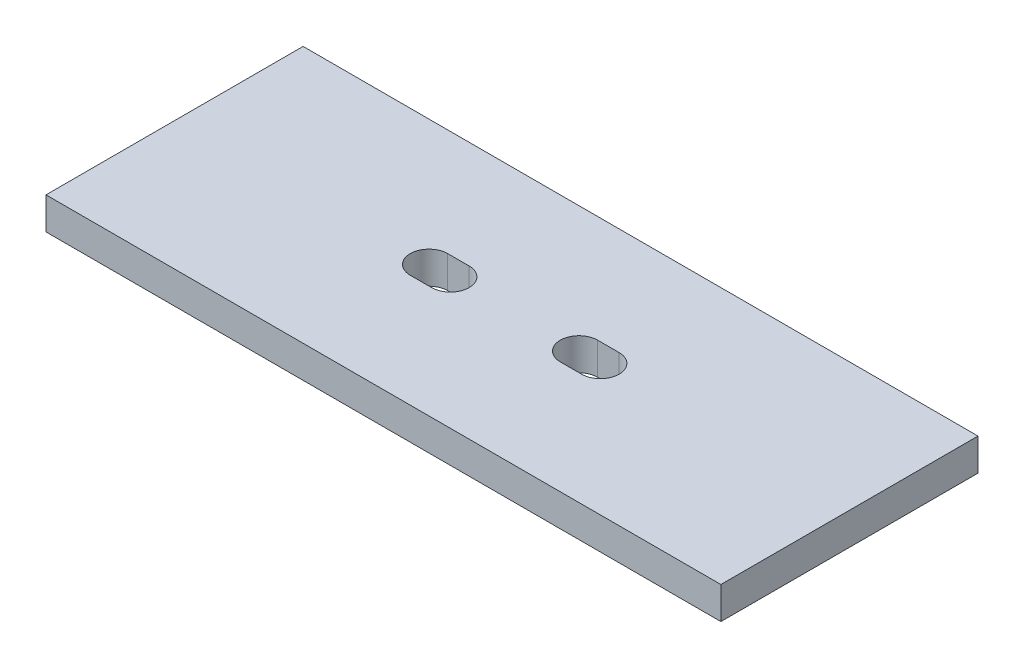
ISO-10303-21;
HEADER;
FILE_DESCRIPTION(('STEP AP214'),'2;1');
FILE_NAME('part.step','',(''),(''),'','','');
FILE_SCHEMA(('AUTOMOTIVE_DESIGN { 1 0 10303 214 1 1 1 1 }'));
ENDSEC;
DATA;
#1=APPLICATION_CONTEXT('core data for automotive mechanical design processes');
#2=APPLICATION_PROTOCOL_DEFINITION('international standard','automotive_design',2000,#1);
#3=PRODUCT_CONTEXT('',#1,'mechanical');
#4=PRODUCT('Part','Part','',(#3));
#5=PRODUCT_RELATED_PRODUCT_CATEGORY('part','',(#4));
#6=PRODUCT_DEFINITION_FORMATION('','',#4);
#7=PRODUCT_DEFINITION_CONTEXT('part definition',#1,'design');
#8=PRODUCT_DEFINITION('design','',#6,#7);
#9=PRODUCT_DEFINITION_SHAPE('','',#8);
#10=(LENGTH_UNIT() NAMED_UNIT(*) SI_UNIT(.MILLI.,.METRE.));
#11=(NAMED_UNIT(*) PLANE_ANGLE_UNIT() SI_UNIT($,.RADIAN.));
#12=(NAMED_UNIT(*) SI_UNIT($,.STERADIAN.) SOLID_ANGLE_UNIT());
#13=UNCERTAINTY_MEASURE_WITH_UNIT(LENGTH_MEASURE(1.E-05),#10,'distance_accuracy_value','');
#14=(GEOMETRIC_REPRESENTATION_CONTEXT(3) GLOBAL_UNCERTAINTY_ASSIGNED_CONTEXT((#13)) GLOBAL_UNIT_ASSIGNED_CONTEXT((#10,
#11,#12)) REPRESENTATION_CONTEXT('',''));
#15=CARTESIAN_POINT('',(0.,0.,0.));
#16=DIRECTION('',(0.,0.,1.));
#17=DIRECTION('',(1.,0.,0.));
#18=AXIS2_PLACEMENT_3D('',#15,#16,#17);
#19=CARTESIAN_POINT('',(31.5,3.,-12.));
#20=DIRECTION('',(-1.,0.,0.));
#21=DIRECTION('',(0.,0.,1.));
#22=AXIS2_PLACEMENT_3D('',#19,#20,#21);
#23=PLANE('',#22);
#24=DIRECTION('',(0.,0.,-1.));
#25=VECTOR('',#24,1.);
#26=CARTESIAN_POINT('',(31.5,0.,-12.));
#27=LINE('',#26,#25);
#28=CARTESIAN_POINT('',(31.5,0.,12.));
#29=VERTEX_POINT('',#28);
#30=CARTESIAN_POINT('',(31.5,0.,-12.));
#31=VERTEX_POINT('',#30);
#32=EDGE_CURVE('E175',#29,#31,#27,.T.);
#33=ORIENTED_EDGE('',*,*,#32,.T.);
#34=DIRECTION('',(0.,-1.,0.));
#35=VECTOR('',#34,1.);
#36=CARTESIAN_POINT('',(31.5,3.,-12.));
#37=LINE('',#36,#35);
#38=CARTESIAN_POINT('',(31.5,3.,-12.));
#39=VERTEX_POINT('',#38);
#40=EDGE_CURVE('E11',#39,#31,#37,.T.);
#41=ORIENTED_EDGE('',*,*,#40,.F.);
#42=DIRECTION('',(0.,0.,-1.));
#43=VECTOR('',#42,1.);
#44=CARTESIAN_POINT('',(31.5,3.,-12.));
#45=LINE('',#44,#43);
#46=CARTESIAN_POINT('',(31.5,3.,12.));
#47=VERTEX_POINT('',#46);
#48=EDGE_CURVE('E222',#47,#39,#45,.T.);
#49=ORIENTED_EDGE('',*,*,#48,.F.);
#50=DIRECTION('',(0.,-1.,0.));
#51=VECTOR('',#50,1.);
#52=CARTESIAN_POINT('',(31.5,3.,12.));
#53=LINE('',#52,#51);
#54=EDGE_CURVE('E236',#47,#29,#53,.T.);
#55=ORIENTED_EDGE('',*,*,#54,.T.);
#56=EDGE_LOOP('',(#33,#41,#49,#55));
#57=FACE_BOUND('',#56,.T.);
#58=ADVANCED_FACE('F39',(#57),#23,.F.);
#59=CARTESIAN_POINT('',(-31.5,3.,-12.));
#60=DIRECTION('',(0.,0.,1.));
#61=DIRECTION('',(1.,0.,0.));
#62=AXIS2_PLACEMENT_3D('',#59,#60,#61);
#63=PLANE('',#62);
#64=DIRECTION('',(-1.,0.,0.));
#65=VECTOR('',#64,1.);
#66=CARTESIAN_POINT('',(-31.5,0.,-12.));
#67=LINE('',#66,#65);
#68=CARTESIAN_POINT('',(-31.5,0.,-12.));
#69=VERTEX_POINT('',#68);
#70=EDGE_CURVE('E240',#31,#69,#67,.T.);
#71=ORIENTED_EDGE('',*,*,#70,.T.);
#72=DIRECTION('',(0.,-1.,0.));
#73=VECTOR('',#72,1.);
#74=CARTESIAN_POINT('',(-31.5,3.,-12.));
#75=LINE('',#74,#73);
#76=CARTESIAN_POINT('',(-31.5,3.,-12.));
#77=VERTEX_POINT('',#76);
#78=EDGE_CURVE('E47',#77,#69,#75,.T.);
#79=ORIENTED_EDGE('',*,*,#78,.F.);
#80=DIRECTION('',(-1.,0.,0.));
#81=VECTOR('',#80,1.);
#82=CARTESIAN_POINT('',(-31.5,3.,-12.));
#83=LINE('',#82,#81);
#84=EDGE_CURVE('E226',#39,#77,#83,.T.);
#85=ORIENTED_EDGE('',*,*,#84,.F.);
#86=ORIENTED_EDGE('',*,*,#40,.T.);
#87=EDGE_LOOP('',(#71,#79,#85,#86));
#88=FACE_BOUND('',#87,.T.);
#89=ADVANCED_FACE('F275',(#88),#63,.F.);
#90=CARTESIAN_POINT('',(-31.5,3.,-12.));
#91=DIRECTION('',(1.,0.,0.));
#92=DIRECTION('',(0.,0.,-1.));
#93=AXIS2_PLACEMENT_3D('',#90,#91,#92);
#94=PLANE('',#93);
#95=DIRECTION('',(0.,0.,1.));
#96=VECTOR('',#95,1.);
#97=CARTESIAN_POINT('',(-31.5,0.,-12.));
#98=LINE('',#97,#96);
#99=CARTESIAN_POINT('',(-31.5,0.,12.));
#100=VERTEX_POINT('',#99);
#101=EDGE_CURVE('E243',#69,#100,#98,.T.);
#102=ORIENTED_EDGE('',*,*,#101,.T.);
#103=DIRECTION('',(0.,-1.,0.));
#104=VECTOR('',#103,1.);
#105=CARTESIAN_POINT('',(-31.5,3.,12.));
#106=LINE('',#105,#104);
#107=CARTESIAN_POINT('',(-31.5,3.,12.));
#108=VERTEX_POINT('',#107);
#109=EDGE_CURVE('E251',#108,#100,#106,.T.);
#110=ORIENTED_EDGE('',*,*,#109,.F.);
#111=DIRECTION('',(0.,0.,1.));
#112=VECTOR('',#111,1.);
#113=CARTESIAN_POINT('',(-31.5,3.,-12.));
#114=LINE('',#113,#112);
#115=EDGE_CURVE('E230',#77,#108,#114,.T.);
#116=ORIENTED_EDGE('',*,*,#115,.F.);
#117=ORIENTED_EDGE('',*,*,#78,.T.);
#118=EDGE_LOOP('',(#102,#110,#116,#117));
#119=FACE_BOUND('',#118,.T.);
#120=ADVANCED_FACE('F260',(#119),#94,.F.);
#121=CARTESIAN_POINT('',(-31.5,3.,12.));
#122=DIRECTION('',(0.,0.,-1.));
#123=DIRECTION('',(-1.,0.,0.));
#124=AXIS2_PLACEMENT_3D('',#121,#122,#123);
#125=PLANE('',#124);
#126=DIRECTION('',(1.,0.,0.));
#127=VECTOR('',#126,1.);
#128=CARTESIAN_POINT('',(-31.5,0.,12.));
#129=LINE('',#128,#127);
#130=EDGE_CURVE('E227',#100,#29,#129,.T.);
#131=ORIENTED_EDGE('',*,*,#130,.T.);
#132=ORIENTED_EDGE('',*,*,#54,.F.);
#133=DIRECTION('',(1.,0.,0.));
#134=VECTOR('',#133,1.);
#135=CARTESIAN_POINT('',(-31.5,3.,12.));
#136=LINE('',#135,#134);
#137=EDGE_CURVE('E233',#108,#47,#136,.T.);
#138=ORIENTED_EDGE('',*,*,#137,.F.);
#139=ORIENTED_EDGE('',*,*,#109,.T.);
#140=EDGE_LOOP('',(#131,#132,#138,#139));
#141=FACE_BOUND('',#140,.T.);
#142=ADVANCED_FACE('F268',(#141),#125,.F.);
#143=CARTESIAN_POINT('',(0.,3.,0.));
#144=DIRECTION('',(0.,1.,0.));
#145=DIRECTION('',(0.,0.,1.));
#146=AXIS2_PLACEMENT_3D('',#143,#144,#145);
#147=PLANE('',#146);
#148=CARTESIAN_POINT('',(-6.00000000000002,3.,-0.250000000000005));
#149=DIRECTION('',(0.,1.,0.));
#150=DIRECTION('',(0.,0.,1.));
#151=AXIS2_PLACEMENT_3D('',#148,#149,#150);
#152=CIRCLE('',#151,1.75);
#153=CARTESIAN_POINT('',(-6.00000000000002,3.,1.49999999999999));
#154=VERTEX_POINT('',#153);
#155=CARTESIAN_POINT('',(-6.00000000000002,3.,-2.00000000000001));
#156=VERTEX_POINT('',#155);
#157=EDGE_CURVE('E54',#154,#156,#152,.T.);
#158=ORIENTED_EDGE('',*,*,#157,.F.);
#159=DIRECTION('',(1.,0.,0.));
#160=VECTOR('',#159,1.);
#161=CARTESIAN_POINT('',(-6.00000000000002,3.,1.49999999999999));
#162=LINE('',#161,#160);
#163=CARTESIAN_POINT('',(-8.00000000000002,3.,1.5));
#164=VERTEX_POINT('',#163);
#165=EDGE_CURVE('E152',#164,#154,#162,.T.);
#166=ORIENTED_EDGE('',*,*,#165,.F.);
#167=CARTESIAN_POINT('',(-8.00000000000002,3.,-0.250000000000004));
#168=DIRECTION('',(0.,1.,0.));
#169=DIRECTION('',(0.,0.,1.));
#170=AXIS2_PLACEMENT_3D('',#167,#168,#169);
#171=CIRCLE('',#170,1.75);
#172=CARTESIAN_POINT('',(-8.00000000000002,3.,-2.));
#173=VERTEX_POINT('',#172);
#174=EDGE_CURVE('E156',#173,#164,#171,.T.);
#175=ORIENTED_EDGE('',*,*,#174,.F.);
#176=DIRECTION('',(-1.,0.,0.));
#177=VECTOR('',#176,1.);
#178=CARTESIAN_POINT('',(-6.00000000000002,3.,-2.00000000000001));
#179=LINE('',#178,#177);
#180=EDGE_CURVE('E165',#156,#173,#179,.T.);
#181=ORIENTED_EDGE('',*,*,#180,.F.);
#182=EDGE_LOOP('',(#158,#166,#175,#181));
#183=FACE_BOUND('',#182,.T.);
#184=CARTESIAN_POINT('',(5.99999999999998,3.,-0.250000000000005));
#185=DIRECTION('',(0.,1.,0.));
#186=DIRECTION('',(0.,0.,1.));
#187=AXIS2_PLACEMENT_3D('',#184,#185,#186);
#188=CIRCLE('',#187,1.75);
#189=CARTESIAN_POINT('',(5.99999999999998,3.,-2.00000000000001));
#190=VERTEX_POINT('',#189);
#191=CARTESIAN_POINT('',(5.99999999999998,3.,1.49999999999999));
#192=VERTEX_POINT('',#191);
#193=EDGE_CURVE('E62',#190,#192,#188,.T.);
#194=ORIENTED_EDGE('',*,*,#193,.F.);
#195=DIRECTION('',(-1.,0.,0.));
#196=VECTOR('',#195,1.);
#197=CARTESIAN_POINT('',(5.99999999999998,3.,-2.00000000000001));
#198=LINE('',#197,#196);
#199=CARTESIAN_POINT('',(7.99999999999998,3.,-2.00000000000001));
#200=VERTEX_POINT('',#199);
#201=EDGE_CURVE('E186',#200,#190,#198,.T.);
#202=ORIENTED_EDGE('',*,*,#201,.F.);
#203=CARTESIAN_POINT('',(7.99999999999998,3.,-0.250000000000006));
#204=DIRECTION('',(0.,1.,0.));
#205=DIRECTION('',(0.,0.,1.));
#206=AXIS2_PLACEMENT_3D('',#203,#204,#205);
#207=CIRCLE('',#206,1.75);
#208=CARTESIAN_POINT('',(7.99999999999998,3.,1.49999999999999));
#209=VERTEX_POINT('',#208);
#210=EDGE_CURVE('E205',#209,#200,#207,.T.);
#211=ORIENTED_EDGE('',*,*,#210,.F.);
#212=DIRECTION('',(1.,0.,0.));
#213=VECTOR('',#212,1.);
#214=CARTESIAN_POINT('',(5.99999999999998,3.,1.49999999999999));
#215=LINE('',#214,#213);
#216=EDGE_CURVE('E201',#192,#209,#215,.T.);
#217=ORIENTED_EDGE('',*,*,#216,.F.);
#218=EDGE_LOOP('',(#194,#202,#211,#217));
#219=FACE_BOUND('',#218,.T.);
#220=ORIENTED_EDGE('',*,*,#48,.T.);
#221=ORIENTED_EDGE('',*,*,#84,.T.);
#222=ORIENTED_EDGE('',*,*,#115,.T.);
#223=ORIENTED_EDGE('',*,*,#137,.T.);
#224=EDGE_LOOP('',(#220,#221,#222,#223));
#225=FACE_BOUND('',#224,.T.);
#226=ADVANCED_FACE('F274',(#183,#219,#225),#147,.T.);
#227=CARTESIAN_POINT('',(0.,0.,0.));
#228=DIRECTION('',(0.,1.,0.));
#229=DIRECTION('',(0.,0.,1.));
#230=AXIS2_PLACEMENT_3D('',#227,#228,#229);
#231=PLANE('',#230);
#232=DIRECTION('',(1.,0.,0.));
#233=VECTOR('',#232,1.);
#234=CARTESIAN_POINT('',(-6.00000000000002,0.,1.49999999999999));
#235=LINE('',#234,#233);
#236=CARTESIAN_POINT('',(-8.00000000000002,0.,1.5));
#237=VERTEX_POINT('',#236);
#238=CARTESIAN_POINT('',(-6.00000000000002,0.,1.49999999999999));
#239=VERTEX_POINT('',#238);
#240=EDGE_CURVE('E137',#237,#239,#235,.T.);
#241=ORIENTED_EDGE('',*,*,#240,.T.);
#242=CARTESIAN_POINT('',(-6.00000000000002,0.,-0.250000000000005));
#243=DIRECTION('',(0.,1.,0.));
#244=DIRECTION('',(0.,0.,1.));
#245=AXIS2_PLACEMENT_3D('',#242,#243,#244);
#246=CIRCLE('',#245,1.75);
#247=CARTESIAN_POINT('',(-6.00000000000002,0.,-2.00000000000001));
#248=VERTEX_POINT('',#247);
#249=EDGE_CURVE('E130',#239,#248,#246,.T.);
#250=ORIENTED_EDGE('',*,*,#249,.T.);
#251=DIRECTION('',(-1.,0.,0.));
#252=VECTOR('',#251,1.);
#253=CARTESIAN_POINT('',(-6.00000000000002,0.,-2.00000000000001));
#254=LINE('',#253,#252);
#255=CARTESIAN_POINT('',(-8.00000000000002,0.,-2.));
#256=VERTEX_POINT('',#255);
#257=EDGE_CURVE('E141',#248,#256,#254,.T.);
#258=ORIENTED_EDGE('',*,*,#257,.T.);
#259=CARTESIAN_POINT('',(-8.00000000000002,0.,-0.250000000000004));
#260=DIRECTION('',(0.,1.,0.));
#261=DIRECTION('',(0.,0.,1.));
#262=AXIS2_PLACEMENT_3D('',#259,#260,#261);
#263=CIRCLE('',#262,1.75);
#264=EDGE_CURVE('E146',#256,#237,#263,.T.);
#265=ORIENTED_EDGE('',*,*,#264,.T.);
#266=EDGE_LOOP('',(#241,#250,#258,#265));
#267=FACE_BOUND('',#266,.T.);
#268=DIRECTION('',(-1.,0.,0.));
#269=VECTOR('',#268,1.);
#270=CARTESIAN_POINT('',(5.99999999999998,0.,-2.00000000000001));
#271=LINE('',#270,#269);
#272=CARTESIAN_POINT('',(7.99999999999998,0.,-2.00000000000001));
#273=VERTEX_POINT('',#272);
#274=CARTESIAN_POINT('',(5.99999999999998,0.,-2.00000000000001));
#275=VERTEX_POINT('',#274);
#276=EDGE_CURVE('E194',#273,#275,#271,.T.);
#277=ORIENTED_EDGE('',*,*,#276,.T.);
#278=CARTESIAN_POINT('',(5.99999999999998,0.,-0.250000000000005));
#279=DIRECTION('',(0.,1.,0.));
#280=DIRECTION('',(0.,0.,1.));
#281=AXIS2_PLACEMENT_3D('',#278,#279,#280);
#282=CIRCLE('',#281,1.75);
#283=CARTESIAN_POINT('',(5.99999999999998,0.,1.49999999999999));
#284=VERTEX_POINT('',#283);
#285=EDGE_CURVE('E181',#275,#284,#282,.T.);
#286=ORIENTED_EDGE('',*,*,#285,.T.);
#287=DIRECTION('',(1.,0.,0.));
#288=VECTOR('',#287,1.);
#289=CARTESIAN_POINT('',(5.99999999999998,0.,1.49999999999999));
#290=LINE('',#289,#288);
#291=CARTESIAN_POINT('',(7.99999999999998,0.,1.49999999999999));
#292=VERTEX_POINT('',#291);
#293=EDGE_CURVE('E185',#284,#292,#290,.T.);
#294=ORIENTED_EDGE('',*,*,#293,.T.);
#295=CARTESIAN_POINT('',(7.99999999999998,0.,-0.250000000000006));
#296=DIRECTION('',(0.,1.,0.));
#297=DIRECTION('',(0.,0.,1.));
#298=AXIS2_PLACEMENT_3D('',#295,#296,#297);
#299=CIRCLE('',#298,1.75);
#300=EDGE_CURVE('E190',#292,#273,#299,.T.);
#301=ORIENTED_EDGE('',*,*,#300,.T.);
#302=EDGE_LOOP('',(#277,#286,#294,#301));
#303=FACE_BOUND('',#302,.T.);
#304=ORIENTED_EDGE('',*,*,#32,.F.);
#305=ORIENTED_EDGE('',*,*,#130,.F.);
#306=ORIENTED_EDGE('',*,*,#101,.F.);
#307=ORIENTED_EDGE('',*,*,#70,.F.);
#308=EDGE_LOOP('',(#304,#305,#306,#307));
#309=FACE_BOUND('',#308,.T.);
#310=ADVANCED_FACE('F148',(#267,#303,#309),#231,.F.);
#311=CARTESIAN_POINT('',(5.99999999999998,0.,-0.250000000000005));
#312=DIRECTION('',(0.,1.,0.));
#313=DIRECTION('',(0.,0.,1.));
#314=AXIS2_PLACEMENT_3D('',#311,#312,#313);
#315=CYLINDRICAL_SURFACE('',#314,1.75);
#316=ORIENTED_EDGE('',*,*,#193,.T.);
#317=DIRECTION('',(0.,1.,0.));
#318=VECTOR('',#317,1.);
#319=CARTESIAN_POINT('',(5.99999999999998,0.,1.49999999999999));
#320=LINE('',#319,#318);
#321=EDGE_CURVE('E198',#284,#192,#320,.T.);
#322=ORIENTED_EDGE('',*,*,#321,.F.);
#323=ORIENTED_EDGE('',*,*,#285,.F.);
#324=DIRECTION('',(0.,1.,0.));
#325=VECTOR('',#324,1.);
#326=CARTESIAN_POINT('',(5.99999999999998,0.,-2.00000000000001));
#327=LINE('',#326,#325);
#328=EDGE_CURVE('E166',#275,#190,#327,.T.);
#329=ORIENTED_EDGE('',*,*,#328,.T.);
#330=EDGE_LOOP('',(#316,#322,#323,#329));
#331=FACE_BOUND('',#330,.T.);
#332=ADVANCED_FACE('F287',(#331),#315,.F.);
#333=CARTESIAN_POINT('',(5.99999999999998,0.,-2.00000000000001));
#334=DIRECTION('',(0.,0.,-1.));
#335=DIRECTION('',(-1.,0.,0.));
#336=AXIS2_PLACEMENT_3D('',#333,#334,#335);
#337=PLANE('',#336);
#338=ORIENTED_EDGE('',*,*,#201,.T.);
#339=ORIENTED_EDGE('',*,*,#328,.F.);
#340=ORIENTED_EDGE('',*,*,#276,.F.);
#341=DIRECTION('',(0.,1.,0.));
#342=VECTOR('',#341,1.);
#343=CARTESIAN_POINT('',(7.99999999999998,0.,-2.00000000000001));
#344=LINE('',#343,#342);
#345=EDGE_CURVE('E214',#273,#200,#344,.T.);
#346=ORIENTED_EDGE('',*,*,#345,.T.);
#347=EDGE_LOOP('',(#338,#339,#340,#346));
#348=FACE_BOUND('',#347,.T.);
#349=ADVANCED_FACE('F293',(#348),#337,.F.);
#350=CARTESIAN_POINT('',(7.99999999999998,0.,-0.250000000000006));
#351=DIRECTION('',(0.,1.,0.));
#352=DIRECTION('',(0.,0.,1.));
#353=AXIS2_PLACEMENT_3D('',#350,#351,#352);
#354=CYLINDRICAL_SURFACE('',#353,1.75);
#355=ORIENTED_EDGE('',*,*,#210,.T.);
#356=ORIENTED_EDGE('',*,*,#345,.F.);
#357=ORIENTED_EDGE('',*,*,#300,.F.);
#358=DIRECTION('',(0.,1.,0.));
#359=VECTOR('',#358,1.);
#360=CARTESIAN_POINT('',(7.99999999999998,0.,1.49999999999999));
#361=LINE('',#360,#359);
#362=EDGE_CURVE('E217',#292,#209,#361,.T.);
#363=ORIENTED_EDGE('',*,*,#362,.T.);
#364=EDGE_LOOP('',(#355,#356,#357,#363));
#365=FACE_BOUND('',#364,.T.);
#366=ADVANCED_FACE('F297',(#365),#354,.F.);
#367=CARTESIAN_POINT('',(5.99999999999998,0.,1.49999999999999));
#368=DIRECTION('',(0.,0.,1.));
#369=DIRECTION('',(1.,0.,0.));
#370=AXIS2_PLACEMENT_3D('',#367,#368,#369);
#371=PLANE('',#370);
#372=ORIENTED_EDGE('',*,*,#216,.T.);
#373=ORIENTED_EDGE('',*,*,#362,.F.);
#374=ORIENTED_EDGE('',*,*,#293,.F.);
#375=ORIENTED_EDGE('',*,*,#321,.T.);
#376=EDGE_LOOP('',(#372,#373,#374,#375));
#377=FACE_BOUND('',#376,.T.);
#378=ADVANCED_FACE('F294',(#377),#371,.F.);
#379=CARTESIAN_POINT('',(-6.00000000000002,0.,-0.250000000000005));
#380=DIRECTION('',(0.,1.,0.));
#381=DIRECTION('',(0.,0.,1.));
#382=AXIS2_PLACEMENT_3D('',#379,#380,#381);
#383=CYLINDRICAL_SURFACE('',#382,1.75);
#384=ORIENTED_EDGE('',*,*,#157,.T.);
#385=DIRECTION('',(0.,1.,0.));
#386=VECTOR('',#385,1.);
#387=CARTESIAN_POINT('',(-6.00000000000002,0.,-2.00000000000001));
#388=LINE('',#387,#386);
#389=EDGE_CURVE('E126',#248,#156,#388,.T.);
#390=ORIENTED_EDGE('',*,*,#389,.F.);
#391=ORIENTED_EDGE('',*,*,#249,.F.);
#392=DIRECTION('',(0.,1.,0.));
#393=VECTOR('',#392,1.);
#394=CARTESIAN_POINT('',(-6.00000000000002,0.,1.49999999999999));
#395=LINE('',#394,#393);
#396=EDGE_CURVE('E172',#239,#154,#395,.T.);
#397=ORIENTED_EDGE('',*,*,#396,.T.);
#398=EDGE_LOOP('',(#384,#390,#391,#397));
#399=FACE_BOUND('',#398,.T.);
#400=ADVANCED_FACE('F128',(#399),#383,.F.);
#401=CARTESIAN_POINT('',(-6.00000000000002,0.,1.49999999999999));
#402=DIRECTION('',(0.,0.,1.));
#403=DIRECTION('',(1.,0.,0.));
#404=AXIS2_PLACEMENT_3D('',#401,#402,#403);
#405=PLANE('',#404);
#406=ORIENTED_EDGE('',*,*,#165,.T.);
#407=ORIENTED_EDGE('',*,*,#396,.F.);
#408=ORIENTED_EDGE('',*,*,#240,.F.);
#409=DIRECTION('',(0.,1.,0.));
#410=VECTOR('',#409,1.);
#411=CARTESIAN_POINT('',(-8.00000000000002,0.,1.5));
#412=LINE('',#411,#410);
#413=EDGE_CURVE('E176',#237,#164,#412,.T.);
#414=ORIENTED_EDGE('',*,*,#413,.T.);
#415=EDGE_LOOP('',(#406,#407,#408,#414));
#416=FACE_BOUND('',#415,.T.);
#417=ADVANCED_FACE('F307',(#416),#405,.F.);
#418=CARTESIAN_POINT('',(-8.00000000000002,0.,-0.250000000000004));
#419=DIRECTION('',(0.,1.,0.));
#420=DIRECTION('',(0.,0.,1.));
#421=AXIS2_PLACEMENT_3D('',#418,#419,#420);
#422=CYLINDRICAL_SURFACE('',#421,1.75);
#423=ORIENTED_EDGE('',*,*,#174,.T.);
#424=ORIENTED_EDGE('',*,*,#413,.F.);
#425=ORIENTED_EDGE('',*,*,#264,.F.);
#426=DIRECTION('',(0.,1.,0.));
#427=VECTOR('',#426,1.);
#428=CARTESIAN_POINT('',(-8.00000000000002,0.,-2.));
#429=LINE('',#428,#427);
#430=EDGE_CURVE('E136',#256,#173,#429,.T.);
#431=ORIENTED_EDGE('',*,*,#430,.T.);
#432=EDGE_LOOP('',(#423,#424,#425,#431));
#433=FACE_BOUND('',#432,.T.);
#434=ADVANCED_FACE('F310',(#433),#422,.F.);
#435=CARTESIAN_POINT('',(-6.00000000000002,0.,-2.00000000000001));
#436=DIRECTION('',(0.,0.,-1.));
#437=DIRECTION('',(-1.,0.,0.));
#438=AXIS2_PLACEMENT_3D('',#435,#436,#437);
#439=PLANE('',#438);
#440=ORIENTED_EDGE('',*,*,#180,.T.);
#441=ORIENTED_EDGE('',*,*,#430,.F.);
#442=ORIENTED_EDGE('',*,*,#257,.F.);
#443=ORIENTED_EDGE('',*,*,#389,.T.);
#444=EDGE_LOOP('',(#440,#441,#442,#443));
#445=FACE_BOUND('',#444,.T.);
#446=ADVANCED_FACE('F142',(#445),#439,.F.);
#447=CLOSED_SHELL('',(#58,#89,#120,#142,#226,#310,#332,#349,#366,#378,#400,#417,#434,#446));
#448=MANIFOLD_SOLID_BREP('B2',#447);
#449=ADVANCED_BREP_SHAPE_REPRESENTATION('',(#18,#448),#14);
#450=SHAPE_DEFINITION_REPRESENTATION(#9,#449);
ENDSEC;
END-ISO-10303-21;
